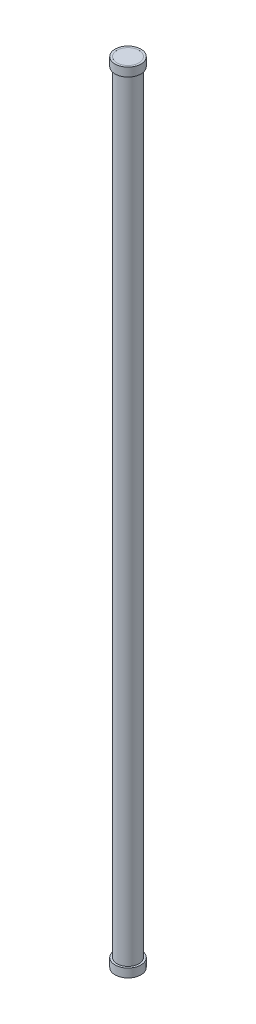
ISO-10303-21;
HEADER;
FILE_DESCRIPTION(('STEP AP214'),'2;1');
FILE_NAME('part.step','',(''),(''),'','','');
FILE_SCHEMA(('AUTOMOTIVE_DESIGN { 1 0 10303 214 1 1 1 1 }'));
ENDSEC;
DATA;
#1=APPLICATION_CONTEXT('core data for automotive mechanical design processes');
#2=APPLICATION_PROTOCOL_DEFINITION('international standard','automotive_design',2000,#1);
#3=PRODUCT_CONTEXT('',#1,'mechanical');
#4=PRODUCT('Part','Part','',(#3));
#5=PRODUCT_RELATED_PRODUCT_CATEGORY('part','',(#4));
#6=PRODUCT_DEFINITION_FORMATION('','',#4);
#7=PRODUCT_DEFINITION_CONTEXT('part definition',#1,'design');
#8=PRODUCT_DEFINITION('design','',#6,#7);
#9=PRODUCT_DEFINITION_SHAPE('','',#8);
#10=(LENGTH_UNIT() NAMED_UNIT(*) SI_UNIT(.MILLI.,.METRE.));
#11=(NAMED_UNIT(*) PLANE_ANGLE_UNIT() SI_UNIT($,.RADIAN.));
#12=(NAMED_UNIT(*) SI_UNIT($,.STERADIAN.) SOLID_ANGLE_UNIT());
#13=UNCERTAINTY_MEASURE_WITH_UNIT(LENGTH_MEASURE(1.E-05),#10,'distance_accuracy_value','');
#14=(GEOMETRIC_REPRESENTATION_CONTEXT(3) GLOBAL_UNCERTAINTY_ASSIGNED_CONTEXT((#13)) GLOBAL_UNIT_ASSIGNED_CONTEXT((#10,
#11,#12)) REPRESENTATION_CONTEXT('',''));
#15=CARTESIAN_POINT('',(0.,0.,0.));
#16=DIRECTION('',(0.,0.,1.));
#17=DIRECTION('',(1.,0.,0.));
#18=AXIS2_PLACEMENT_3D('',#15,#16,#17);
#19=CARTESIAN_POINT('',(0.,905.,0.));
#20=DIRECTION('',(0.,1.,0.));
#21=DIRECTION('',(0.,0.,1.));
#22=AXIS2_PLACEMENT_3D('',#19,#20,#21);
#23=CYLINDRICAL_SURFACE('',#22,15.);
#24=CARTESIAN_POINT('',(0.,905.,0.));
#25=DIRECTION('',(0.,1.,0.));
#26=DIRECTION('',(0.,0.,1.));
#27=AXIS2_PLACEMENT_3D('',#24,#25,#26);
#28=CIRCLE('',#27,15.);
#29=CARTESIAN_POINT('',(0.,905.,15.));
#30=VERTEX_POINT('',#29);
#31=EDGE_CURVE('E11',#30,#30,#28,.T.);
#32=ORIENTED_EDGE('',*,*,#31,.T.);
#33=EDGE_LOOP('',(#32));
#34=FACE_BOUND('',#33,.T.);
#35=CARTESIAN_POINT('',(0.,915.,0.));
#36=DIRECTION('',(0.,1.,0.));
#37=DIRECTION('',(0.,0.,1.));
#38=AXIS2_PLACEMENT_3D('',#35,#36,#37);
#39=CIRCLE('',#38,15.);
#40=CARTESIAN_POINT('',(0.,915.,15.));
#41=VERTEX_POINT('',#40);
#42=EDGE_CURVE('E47',#41,#41,#39,.T.);
#43=ORIENTED_EDGE('',*,*,#42,.F.);
#44=EDGE_LOOP('',(#43));
#45=FACE_BOUND('',#44,.T.);
#46=ADVANCED_FACE('F44',(#34,#45),#23,.T.);
#47=CARTESIAN_POINT('',(0.,905.,0.));
#48=DIRECTION('',(0.,1.,0.));
#49=DIRECTION('',(0.,0.,1.));
#50=AXIS2_PLACEMENT_3D('',#47,#48,#49);
#51=PLANE('',#50);
#52=CARTESIAN_POINT('',(0.,905.,0.));
#53=DIRECTION('',(0.,1.,0.));
#54=DIRECTION('',(0.,0.,1.));
#55=AXIS2_PLACEMENT_3D('',#52,#53,#54);
#56=CIRCLE('',#55,12.7);
#57=CARTESIAN_POINT('',(0.,905.,12.7));
#58=VERTEX_POINT('',#57);
#59=EDGE_CURVE('E54',#58,#58,#56,.T.);
#60=ORIENTED_EDGE('',*,*,#59,.T.);
#61=EDGE_LOOP('',(#60));
#62=FACE_BOUND('',#61,.T.);
#63=ORIENTED_EDGE('',*,*,#31,.F.);
#64=EDGE_LOOP('',(#63));
#65=FACE_BOUND('',#64,.T.);
#66=ADVANCED_FACE('F62',(#62,#65),#51,.F.);
#67=CARTESIAN_POINT('',(0.,915.,0.));
#68=DIRECTION('',(0.,1.,0.));
#69=DIRECTION('',(0.,0.,1.));
#70=AXIS2_PLACEMENT_3D('',#67,#68,#69);
#71=PLANE('',#70);
#72=CARTESIAN_POINT('',(0.,915.,0.));
#73=DIRECTION('',(0.,1.,0.));
#74=DIRECTION('',(0.,0.,1.));
#75=AXIS2_PLACEMENT_3D('',#72,#73,#74);
#76=CIRCLE('',#75,12.7);
#77=CARTESIAN_POINT('',(0.,915.,12.7));
#78=VERTEX_POINT('',#77);
#79=EDGE_CURVE('E56',#78,#78,#76,.T.);
#80=ORIENTED_EDGE('',*,*,#79,.F.);
#81=EDGE_LOOP('',(#80));
#82=FACE_BOUND('',#81,.T.);
#83=ORIENTED_EDGE('',*,*,#42,.T.);
#84=EDGE_LOOP('',(#83));
#85=FACE_BOUND('',#84,.T.);
#86=ADVANCED_FACE('F68',(#82,#85),#71,.T.);
#87=CARTESIAN_POINT('',(0.,905.,0.));
#88=DIRECTION('',(0.,1.,0.));
#89=DIRECTION('',(0.,0.,1.));
#90=AXIS2_PLACEMENT_3D('',#87,#88,#89);
#91=CYLINDRICAL_SURFACE('',#90,12.7);
#92=ORIENTED_EDGE('',*,*,#59,.F.);
#93=EDGE_LOOP('',(#92));
#94=FACE_BOUND('',#93,.T.);
#95=ORIENTED_EDGE('',*,*,#79,.T.);
#96=EDGE_LOOP('',(#95));
#97=FACE_BOUND('',#96,.T.);
#98=ADVANCED_FACE('F65',(#94,#97),#91,.F.);
#99=CLOSED_SHELL('',(#46,#66,#86,#98));
#100=MANIFOLD_SOLID_BREP('B2',#99);
#101=CARTESIAN_POINT('',(0.,915.,0.));
#102=DIRECTION('',(0.,-1.,0.));
#103=DIRECTION('',(0.,0.,-1.));
#104=AXIS2_PLACEMENT_3D('',#101,#102,#103);
#105=CYLINDRICAL_SURFACE('',#104,12.7);
#106=CARTESIAN_POINT('',(0.,915.,0.));
#107=DIRECTION('',(0.,1.,0.));
#108=DIRECTION('',(0.,0.,1.));
#109=AXIS2_PLACEMENT_3D('',#106,#107,#108);
#110=CIRCLE('',#109,12.7);
#111=CARTESIAN_POINT('',(0.,915.,-12.7));
#112=VERTEX_POINT('',#111);
#113=EDGE_CURVE('E111',#112,#112,#110,.T.);
#114=CARTESIAN_POINT('',(0.,10.,0.));
#115=DIRECTION('',(0.,-1.,0.));
#116=DIRECTION('',(0.,0.,-1.));
#117=AXIS2_PLACEMENT_3D('',#114,#115,#116);
#118=CIRCLE('',#117,12.7);
#119=CARTESIAN_POINT('',(0.,10.0000000000001,-12.7));
#120=VERTEX_POINT('',#119);
#121=EDGE_CURVE('E43',#120,#120,#118,.T.);
#122=CARTESIAN_POINT('',(0.,915.,-12.7));
#123=CARTESIAN_POINT('',(0.,905.572916666667,-12.7));
#124=CARTESIAN_POINT('',(0.,896.145833333333,-12.7));
#125=CARTESIAN_POINT('',(0.,877.291666666667,-12.7));
#126=CARTESIAN_POINT('',(0.,867.864583333333,-12.7));
#127=CARTESIAN_POINT('',(0.,849.010416666667,-12.7));
#128=CARTESIAN_POINT('',(0.,839.583333333333,-12.7));
#129=CARTESIAN_POINT('',(0.,820.729166666667,-12.7));
#130=CARTESIAN_POINT('',(0.,811.302083333333,-12.7));
#131=CARTESIAN_POINT('',(0.,792.447916666667,-12.7));
#132=CARTESIAN_POINT('',(0.,783.020833333333,-12.7));
#133=CARTESIAN_POINT('',(0.,764.166666666667,-12.7));
#134=CARTESIAN_POINT('',(0.,754.739583333333,-12.7));
#135=CARTESIAN_POINT('',(0.,735.885416666667,-12.7));
#136=CARTESIAN_POINT('',(0.,726.458333333333,-12.7));
#137=CARTESIAN_POINT('',(0.,707.604166666667,-12.7));
#138=CARTESIAN_POINT('',(0.,698.177083333333,-12.7));
#139=CARTESIAN_POINT('',(0.,679.322916666667,-12.7));
#140=CARTESIAN_POINT('',(0.,669.895833333333,-12.7));
#141=CARTESIAN_POINT('',(0.,651.041666666667,-12.7));
#142=CARTESIAN_POINT('',(0.,641.614583333333,-12.7));
#143=CARTESIAN_POINT('',(0.,622.760416666667,-12.7));
#144=CARTESIAN_POINT('',(0.,613.333333333333,-12.7));
#145=CARTESIAN_POINT('',(0.,594.479166666667,-12.7));
#146=CARTESIAN_POINT('',(0.,585.052083333333,-12.7));
#147=CARTESIAN_POINT('',(0.,566.197916666667,-12.7));
#148=CARTESIAN_POINT('',(0.,556.770833333333,-12.7));
#149=CARTESIAN_POINT('',(0.,537.916666666667,-12.7));
#150=CARTESIAN_POINT('',(0.,528.489583333333,-12.7));
#151=CARTESIAN_POINT('',(0.,509.635416666667,-12.7));
#152=CARTESIAN_POINT('',(0.,500.208333333333,-12.7));
#153=CARTESIAN_POINT('',(0.,481.354166666667,-12.7));
#154=CARTESIAN_POINT('',(0.,471.927083333333,-12.7));
#155=CARTESIAN_POINT('',(0.,453.072916666667,-12.7));
#156=CARTESIAN_POINT('',(0.,443.645833333333,-12.7));
#157=CARTESIAN_POINT('',(0.,424.791666666667,-12.7));
#158=CARTESIAN_POINT('',(0.,415.364583333333,-12.7));
#159=CARTESIAN_POINT('',(0.,396.510416666667,-12.7));
#160=CARTESIAN_POINT('',(0.,387.083333333333,-12.7));
#161=CARTESIAN_POINT('',(0.,368.229166666667,-12.7));
#162=CARTESIAN_POINT('',(0.,358.802083333333,-12.7));
#163=CARTESIAN_POINT('',(0.,339.947916666667,-12.7));
#164=CARTESIAN_POINT('',(0.,330.520833333333,-12.7));
#165=CARTESIAN_POINT('',(0.,311.666666666667,-12.7));
#166=CARTESIAN_POINT('',(0.,302.239583333333,-12.7));
#167=CARTESIAN_POINT('',(0.,283.385416666667,-12.7));
#168=CARTESIAN_POINT('',(0.,273.958333333333,-12.7));
#169=CARTESIAN_POINT('',(0.,255.104166666667,-12.7));
#170=CARTESIAN_POINT('',(0.,245.677083333333,-12.7));
#171=CARTESIAN_POINT('',(0.,226.822916666667,-12.7));
#172=CARTESIAN_POINT('',(0.,217.395833333333,-12.7));
#173=CARTESIAN_POINT('',(0.,198.541666666667,-12.7));
#174=CARTESIAN_POINT('',(0.,189.114583333333,-12.7));
#175=CARTESIAN_POINT('',(0.,170.260416666667,-12.7));
#176=CARTESIAN_POINT('',(0.,160.833333333333,-12.7));
#177=CARTESIAN_POINT('',(0.,141.979166666667,-12.7));
#178=CARTESIAN_POINT('',(0.,132.552083333333,-12.7));
#179=CARTESIAN_POINT('',(0.,113.697916666667,-12.7));
#180=CARTESIAN_POINT('',(0.,104.270833333333,-12.7));
#181=CARTESIAN_POINT('',(0.,85.4166666666668,-12.7));
#182=CARTESIAN_POINT('',(0.,75.9895833333334,-12.7));
#183=CARTESIAN_POINT('',(0.,57.1354166666668,-12.7));
#184=CARTESIAN_POINT('',(0.,47.7083333333335,-12.7));
#185=CARTESIAN_POINT('',(0.,28.8541666666668,-12.7));
#186=CARTESIAN_POINT('',(0.,19.4270833333334,-12.7));
#187=CARTESIAN_POINT('',(0.,10.0000000000001,-12.7));
#188=B_SPLINE_CURVE_WITH_KNOTS('',3,(#122,#123,#124,#125,#126,#127,#128,#129,#130,#131,#132,
#133,#134,#135,#136,#137,#138,#139,#140,#141,#142,#143,#144,#145,#146,#147,#148,#149,#150,#151,
#152,#153,#154,#155,#156,#157,#158,#159,#160,#161,#162,#163,#164,#165,#166,#167,#168,#169,#170,
#171,#172,#173,#174,#175,#176,#177,#178,#179,#180,#181,#182,#183,#184,#185,#186,#187),
.UNSPECIFIED.,.F.,.F.,(4,2,2,2,2,2,2,2,2,2,2,2,2,2,2,2,2,2,2,2,2,2,2,2,2,2,2,2,2,2,2,2,4),(0.,
28.28125,56.5625000000001,84.84375,113.125,141.40625,169.6875,197.96875,226.25,254.53125,
282.8125,311.09375,339.375,367.65625,395.9375,424.21875,452.5,480.78125,509.0625,537.34375,
565.625,593.90625,622.1875,650.46875,678.75,707.03125,735.3125,763.59375,791.875,820.15625,
848.4375,876.71875,905.),.UNSPECIFIED.);
#189=EDGE_CURVE('BSEAM105',#112,#120,#188,.T.);
#190=ORIENTED_EDGE('',*,*,#113,.F.);
#191=ORIENTED_EDGE('',*,*,#121,.F.);
#192=ORIENTED_EDGE('',*,*,#189,.T.);
#193=ORIENTED_EDGE('',*,*,#189,.F.);
#194=EDGE_LOOP('',(#190,#192,#191,#193));
#195=FACE_BOUND('',#194,.T.);
#196=ADVANCED_FACE('F105',(#195),#105,.T.);
#197=CARTESIAN_POINT('',(0.,915.,0.));
#198=DIRECTION('',(0.,1.,0.));
#199=DIRECTION('',(0.,0.,1.));
#200=AXIS2_PLACEMENT_3D('',#197,#198,#199);
#201=PLANE('',#200);
#202=ORIENTED_EDGE('',*,*,#113,.T.);
#203=EDGE_LOOP('',(#202));
#204=FACE_BOUND('',#203,.T.);
#205=ADVANCED_FACE('F130',(#204),#201,.T.);
#206=CARTESIAN_POINT('',(0.,10.,0.));
#207=DIRECTION('',(0.,-1.,0.));
#208=DIRECTION('',(0.,0.,-1.));
#209=AXIS2_PLACEMENT_3D('',#206,#207,#208);
#210=CYLINDRICAL_SURFACE('',#209,15.);
#211=CARTESIAN_POINT('',(0.,10.,0.));
#212=DIRECTION('',(0.,-1.,0.));
#213=DIRECTION('',(0.,0.,-1.));
#214=AXIS2_PLACEMENT_3D('',#211,#212,#213);
#215=CIRCLE('',#214,15.);
#216=CARTESIAN_POINT('',(0.,10.,-15.));
#217=VERTEX_POINT('',#216);
#218=EDGE_CURVE('E115',#217,#217,#215,.T.);
#219=ORIENTED_EDGE('',*,*,#218,.T.);
#220=EDGE_LOOP('',(#219));
#221=FACE_BOUND('',#220,.T.);
#222=CARTESIAN_POINT('',(0.,0.,0.));
#223=DIRECTION('',(0.,-1.,0.));
#224=DIRECTION('',(0.,0.,-1.));
#225=AXIS2_PLACEMENT_3D('',#222,#223,#224);
#226=CIRCLE('',#225,15.);
#227=CARTESIAN_POINT('',(0.,0.,-15.));
#228=VERTEX_POINT('',#227);
#229=EDGE_CURVE('E119',#228,#228,#226,.T.);
#230=ORIENTED_EDGE('',*,*,#229,.F.);
#231=EDGE_LOOP('',(#230));
#232=FACE_BOUND('',#231,.T.);
#233=ADVANCED_FACE('F127',(#221,#232),#210,.T.);
#234=CARTESIAN_POINT('',(0.,10.,0.));
#235=DIRECTION('',(0.,-1.,0.));
#236=DIRECTION('',(0.,0.,-1.));
#237=AXIS2_PLACEMENT_3D('',#234,#235,#236);
#238=PLANE('',#237);
#239=ORIENTED_EDGE('',*,*,#121,.T.);
#240=EDGE_LOOP('',(#239));
#241=FACE_BOUND('',#240,.T.);
#242=ORIENTED_EDGE('',*,*,#218,.F.);
#243=EDGE_LOOP('',(#242));
#244=FACE_BOUND('',#243,.T.);
#245=ADVANCED_FACE('F129',(#241,#244),#238,.F.);
#246=CARTESIAN_POINT('',(0.,0.,0.));
#247=DIRECTION('',(0.,1.,0.));
#248=DIRECTION('',(0.,0.,1.));
#249=AXIS2_PLACEMENT_3D('',#246,#247,#248);
#250=PLANE('',#249);
#251=ORIENTED_EDGE('',*,*,#229,.T.);
#252=EDGE_LOOP('',(#251));
#253=FACE_BOUND('',#252,.T.);
#254=ADVANCED_FACE('F125',(#253),#250,.F.);
#255=CLOSED_SHELL('',(#196,#205,#233,#245,#254));
#256=MANIFOLD_SOLID_BREP('B6',#255);
#257=ADVANCED_BREP_SHAPE_REPRESENTATION('',(#18,#100,#256),#14);
#258=SHAPE_DEFINITION_REPRESENTATION(#9,#257);
ENDSEC;
END-ISO-10303-21;
